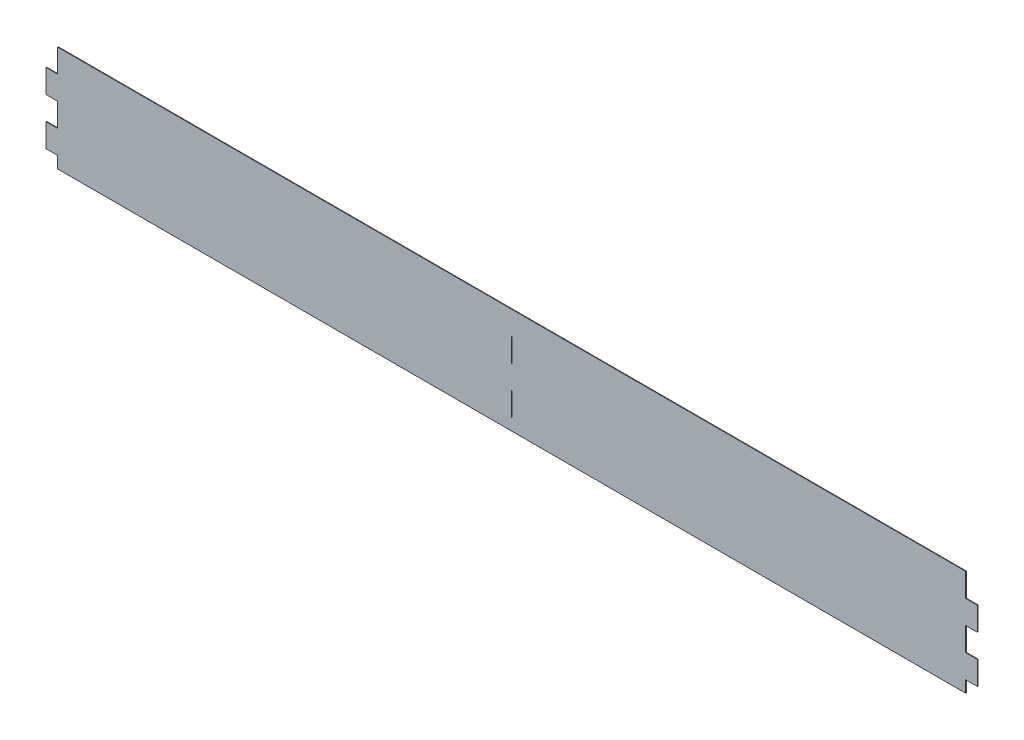
ISO-10303-21;
HEADER;
FILE_DESCRIPTION(('STEP AP214'),'2;1');
FILE_NAME('part.step','',(''),(''),'','','');
FILE_SCHEMA(('AUTOMOTIVE_DESIGN { 1 0 10303 214 1 1 1 1 }'));
ENDSEC;
DATA;
#1=APPLICATION_CONTEXT('core data for automotive mechanical design processes');
#2=APPLICATION_PROTOCOL_DEFINITION('international standard','automotive_design',2000,#1);
#3=PRODUCT_CONTEXT('',#1,'mechanical');
#4=PRODUCT('Part','Part','',(#3));
#5=PRODUCT_RELATED_PRODUCT_CATEGORY('part','',(#4));
#6=PRODUCT_DEFINITION_FORMATION('','',#4);
#7=PRODUCT_DEFINITION_CONTEXT('part definition',#1,'design');
#8=PRODUCT_DEFINITION('design','',#6,#7);
#9=PRODUCT_DEFINITION_SHAPE('','',#8);
#10=(LENGTH_UNIT() NAMED_UNIT(*) SI_UNIT(.MILLI.,.METRE.));
#11=(NAMED_UNIT(*) PLANE_ANGLE_UNIT() SI_UNIT($,.RADIAN.));
#12=(NAMED_UNIT(*) SI_UNIT($,.STERADIAN.) SOLID_ANGLE_UNIT());
#13=UNCERTAINTY_MEASURE_WITH_UNIT(LENGTH_MEASURE(1.E-05),#10,'distance_accuracy_value','');
#14=(GEOMETRIC_REPRESENTATION_CONTEXT(3) GLOBAL_UNCERTAINTY_ASSIGNED_CONTEXT((#13)) GLOBAL_UNIT_ASSIGNED_CONTEXT((#10,
#11,#12)) REPRESENTATION_CONTEXT('',''));
#15=CARTESIAN_POINT('',(0.,0.,0.));
#16=DIRECTION('',(0.,0.,1.));
#17=DIRECTION('',(1.,0.,0.));
#18=AXIS2_PLACEMENT_3D('',#15,#16,#17);
#19=CARTESIAN_POINT('',(-198.5,0.,0.125));
#20=DIRECTION('',(1.,0.,0.));
#21=DIRECTION('',(0.,0.,-1.));
#22=AXIS2_PLACEMENT_3D('',#19,#20,#21);
#23=PLANE('',#22);
#24=DIRECTION('',(0.,-1.,0.));
#25=VECTOR('',#24,1.);
#26=CARTESIAN_POINT('',(-198.5,0.,-0.125));
#27=LINE('',#26,#25);
#28=CARTESIAN_POINT('',(-198.5,35.,-0.125));
#29=VERTEX_POINT('',#28);
#30=CARTESIAN_POINT('',(-198.5,25.,-0.125));
#31=VERTEX_POINT('',#30);
#32=EDGE_CURVE('E243',#29,#31,#27,.T.);
#33=ORIENTED_EDGE('',*,*,#32,.T.);
#34=DIRECTION('',(0.,0.,1.));
#35=VECTOR('',#34,1.);
#36=CARTESIAN_POINT('',(-198.5,25.,-0.125));
#37=LINE('',#36,#35);
#38=CARTESIAN_POINT('',(-198.5,25.,0.125));
#39=VERTEX_POINT('',#38);
#40=EDGE_CURVE('E331',#31,#39,#37,.T.);
#41=ORIENTED_EDGE('',*,*,#40,.T.);
#42=DIRECTION('',(0.,-1.,0.));
#43=VECTOR('',#42,1.);
#44=CARTESIAN_POINT('',(-198.5,0.,0.125));
#45=LINE('',#44,#43);
#46=CARTESIAN_POINT('',(-198.5,35.,0.125));
#47=VERTEX_POINT('',#46);
#48=EDGE_CURVE('E263',#47,#39,#45,.T.);
#49=ORIENTED_EDGE('',*,*,#48,.F.);
#50=DIRECTION('',(0.,0.,1.));
#51=VECTOR('',#50,1.);
#52=CARTESIAN_POINT('',(-198.5,35.,-0.125));
#53=LINE('',#52,#51);
#54=EDGE_CURVE('E361',#29,#47,#53,.T.);
#55=ORIENTED_EDGE('',*,*,#54,.F.);
#56=EDGE_LOOP('',(#33,#41,#49,#55));
#57=FACE_BOUND('',#56,.T.);
#58=ADVANCED_FACE('F35',(#57),#23,.F.);
#59=CARTESIAN_POINT('',(198.5,45.,0.125));
#60=DIRECTION('',(-1.,0.,0.));
#61=DIRECTION('',(0.,0.,1.));
#62=AXIS2_PLACEMENT_3D('',#59,#60,#61);
#63=PLANE('',#62);
#64=DIRECTION('',(0.,1.,0.));
#65=VECTOR('',#64,1.);
#66=CARTESIAN_POINT('',(198.5,45.,0.125));
#67=LINE('',#66,#65);
#68=CARTESIAN_POINT('',(198.5,25.,0.125));
#69=VERTEX_POINT('',#68);
#70=CARTESIAN_POINT('',(198.5,35.,0.125));
#71=VERTEX_POINT('',#70);
#72=EDGE_CURVE('E435',#69,#71,#67,.T.);
#73=ORIENTED_EDGE('',*,*,#72,.F.);
#74=DIRECTION('',(0.,0.,1.));
#75=VECTOR('',#74,1.);
#76=CARTESIAN_POINT('',(198.5,25.,-0.125));
#77=LINE('',#76,#75);
#78=CARTESIAN_POINT('',(198.5,25.,-0.125));
#79=VERTEX_POINT('',#78);
#80=EDGE_CURVE('E304',#79,#69,#77,.T.);
#81=ORIENTED_EDGE('',*,*,#80,.F.);
#82=DIRECTION('',(0.,1.,0.));
#83=VECTOR('',#82,1.);
#84=CARTESIAN_POINT('',(198.5,45.,-0.125));
#85=LINE('',#84,#83);
#86=CARTESIAN_POINT('',(198.5,35.,-0.125));
#87=VERTEX_POINT('',#86);
#88=EDGE_CURVE('E255',#79,#87,#85,.T.);
#89=ORIENTED_EDGE('',*,*,#88,.T.);
#90=DIRECTION('',(0.,0.,1.));
#91=VECTOR('',#90,1.);
#92=CARTESIAN_POINT('',(198.5,35.,-0.125));
#93=LINE('',#92,#91);
#94=EDGE_CURVE('E350',#87,#71,#93,.T.);
#95=ORIENTED_EDGE('',*,*,#94,.T.);
#96=EDGE_LOOP('',(#73,#81,#89,#95));
#97=FACE_BOUND('',#96,.T.);
#98=ADVANCED_FACE('F462',(#97),#63,.F.);
#99=CARTESIAN_POINT('',(-198.5,15.,0.125));
#100=VERTEX_POINT('',#99);
#101=CARTESIAN_POINT('',(-198.5,4.99999999999997,0.125));
#102=VERTEX_POINT('',#101);
#103=EDGE_CURVE('E236',#100,#102,#45,.T.);
#104=ORIENTED_EDGE('',*,*,#103,.F.);
#105=DIRECTION('',(0.,0.,1.));
#106=VECTOR('',#105,1.);
#107=CARTESIAN_POINT('',(-198.5,15.,-0.125));
#108=LINE('',#107,#106);
#109=CARTESIAN_POINT('',(-198.5,15.,-0.125));
#110=VERTEX_POINT('',#109);
#111=EDGE_CURVE('E223',#110,#100,#108,.T.);
#112=ORIENTED_EDGE('',*,*,#111,.F.);
#113=CARTESIAN_POINT('',(-198.5,4.99999999999997,-0.125));
#114=VERTEX_POINT('',#113);
#115=EDGE_CURVE('E234',#110,#114,#27,.T.);
#116=ORIENTED_EDGE('',*,*,#115,.T.);
#117=DIRECTION('',(0.,0.,1.));
#118=VECTOR('',#117,1.);
#119=CARTESIAN_POINT('',(-198.5,4.99999999999997,-0.125));
#120=LINE('',#119,#118);
#121=EDGE_CURVE('E297',#114,#102,#120,.T.);
#122=ORIENTED_EDGE('',*,*,#121,.T.);
#123=EDGE_LOOP('',(#104,#112,#116,#122));
#124=FACE_BOUND('',#123,.T.);
#125=ADVANCED_FACE('F37',(#124),#23,.F.);
#126=CARTESIAN_POINT('',(193.5,0.,0.125));
#127=DIRECTION('',(0.,1.,0.));
#128=DIRECTION('',(0.,0.,1.));
#129=AXIS2_PLACEMENT_3D('',#126,#127,#128);
#130=PLANE('',#129);
#131=DIRECTION('',(1.,0.,0.));
#132=VECTOR('',#131,1.);
#133=CARTESIAN_POINT('',(-193.5,0.,0.125));
#134=LINE('',#133,#132);
#135=CARTESIAN_POINT('',(-193.5,0.,0.125));
#136=VERTEX_POINT('',#135);
#137=CARTESIAN_POINT('',(193.5,0.,0.125));
#138=VERTEX_POINT('',#137);
#139=EDGE_CURVE('E433',#136,#138,#134,.T.);
#140=ORIENTED_EDGE('',*,*,#139,.F.);
#141=DIRECTION('',(0.,0.,-1.));
#142=VECTOR('',#141,1.);
#143=CARTESIAN_POINT('',(-193.5,0.,0.125));
#144=LINE('',#143,#142);
#145=CARTESIAN_POINT('',(-193.5,0.,-0.125));
#146=VERTEX_POINT('',#145);
#147=EDGE_CURVE('E330',#136,#146,#144,.T.);
#148=ORIENTED_EDGE('',*,*,#147,.T.);
#149=DIRECTION('',(1.,0.,0.));
#150=VECTOR('',#149,1.);
#151=CARTESIAN_POINT('',(193.5,0.,-0.125));
#152=LINE('',#151,#150);
#153=CARTESIAN_POINT('',(193.5,0.,-0.125));
#154=VERTEX_POINT('',#153);
#155=EDGE_CURVE('E247',#146,#154,#152,.T.);
#156=ORIENTED_EDGE('',*,*,#155,.T.);
#157=DIRECTION('',(0.,0.,1.));
#158=VECTOR('',#157,1.);
#159=CARTESIAN_POINT('',(193.5,0.,0.125));
#160=LINE('',#159,#158);
#161=EDGE_CURVE('E327',#154,#138,#160,.T.);
#162=ORIENTED_EDGE('',*,*,#161,.T.);
#163=EDGE_LOOP('',(#140,#148,#156,#162));
#164=FACE_BOUND('',#163,.T.);
#165=ADVANCED_FACE('F460',(#164),#130,.F.);
#166=CARTESIAN_POINT('',(198.5,4.99999999999997,-0.125));
#167=VERTEX_POINT('',#166);
#168=CARTESIAN_POINT('',(198.5,15.,-0.125));
#169=VERTEX_POINT('',#168);
#170=EDGE_CURVE('E256',#167,#169,#85,.T.);
#171=ORIENTED_EDGE('',*,*,#170,.T.);
#172=DIRECTION('',(0.,0.,1.));
#173=VECTOR('',#172,1.);
#174=CARTESIAN_POINT('',(198.5,15.,-0.125));
#175=LINE('',#174,#173);
#176=CARTESIAN_POINT('',(198.5,15.,0.125));
#177=VERTEX_POINT('',#176);
#178=EDGE_CURVE('E272',#169,#177,#175,.T.);
#179=ORIENTED_EDGE('',*,*,#178,.T.);
#180=CARTESIAN_POINT('',(198.5,4.99999999999997,0.125));
#181=VERTEX_POINT('',#180);
#182=EDGE_CURVE('E436',#181,#177,#67,.T.);
#183=ORIENTED_EDGE('',*,*,#182,.F.);
#184=DIRECTION('',(0.,0.,1.));
#185=VECTOR('',#184,1.);
#186=CARTESIAN_POINT('',(198.5,4.99999999999997,-0.125));
#187=LINE('',#186,#185);
#188=EDGE_CURVE('E274',#167,#181,#187,.T.);
#189=ORIENTED_EDGE('',*,*,#188,.F.);
#190=EDGE_LOOP('',(#171,#179,#183,#189));
#191=FACE_BOUND('',#190,.T.);
#192=ADVANCED_FACE('F270',(#191),#63,.F.);
#193=CARTESIAN_POINT('',(-198.5,45.,0.125));
#194=DIRECTION('',(0.,-1.,0.));
#195=DIRECTION('',(0.,0.,-1.));
#196=AXIS2_PLACEMENT_3D('',#193,#194,#195);
#197=PLANE('',#196);
#198=DIRECTION('',(-1.,0.,0.));
#199=VECTOR('',#198,1.);
#200=CARTESIAN_POINT('',(198.5,45.,0.125));
#201=LINE('',#200,#199);
#202=CARTESIAN_POINT('',(193.5,45.,0.125));
#203=VERTEX_POINT('',#202);
#204=CARTESIAN_POINT('',(-193.5,45.,0.125));
#205=VERTEX_POINT('',#204);
#206=EDGE_CURVE('E43',#203,#205,#201,.T.);
#207=ORIENTED_EDGE('',*,*,#206,.F.);
#208=DIRECTION('',(0.,0.,1.));
#209=VECTOR('',#208,1.);
#210=CARTESIAN_POINT('',(193.5,45.,-0.125));
#211=LINE('',#210,#209);
#212=CARTESIAN_POINT('',(193.5,45.,-0.125));
#213=VERTEX_POINT('',#212);
#214=EDGE_CURVE('E347',#213,#203,#211,.T.);
#215=ORIENTED_EDGE('',*,*,#214,.F.);
#216=DIRECTION('',(-1.,0.,0.));
#217=VECTOR('',#216,1.);
#218=CARTESIAN_POINT('',(-198.5,45.,-0.125));
#219=LINE('',#218,#217);
#220=CARTESIAN_POINT('',(-193.5,45.,-0.125));
#221=VERTEX_POINT('',#220);
#222=EDGE_CURVE('E257',#213,#221,#219,.T.);
#223=ORIENTED_EDGE('',*,*,#222,.T.);
#224=DIRECTION('',(0.,0.,1.));
#225=VECTOR('',#224,1.);
#226=CARTESIAN_POINT('',(-193.5,45.,-0.125));
#227=LINE('',#226,#225);
#228=EDGE_CURVE('E366',#221,#205,#227,.T.);
#229=ORIENTED_EDGE('',*,*,#228,.T.);
#230=EDGE_LOOP('',(#207,#215,#223,#229));
#231=FACE_BOUND('',#230,.T.);
#232=ADVANCED_FACE('F451',(#231),#197,.F.);
#233=CARTESIAN_POINT('',(0.,0.,0.125));
#234=DIRECTION('',(0.,0.,-1.));
#235=DIRECTION('',(-1.,0.,0.));
#236=AXIS2_PLACEMENT_3D('',#233,#234,#235);
#237=PLANE('',#236);
#238=DIRECTION('',(-1.,0.,0.));
#239=VECTOR('',#238,1.);
#240=CARTESIAN_POINT('',(-0.15,15.,0.125));
#241=LINE('',#240,#239);
#242=CARTESIAN_POINT('',(0.15,15.,0.125));
#243=VERTEX_POINT('',#242);
#244=CARTESIAN_POINT('',(-0.15,15.,0.125));
#245=VERTEX_POINT('',#244);
#246=EDGE_CURVE('E387',#243,#245,#241,.T.);
#247=ORIENTED_EDGE('',*,*,#246,.F.);
#248=DIRECTION('',(0.,1.,0.));
#249=VECTOR('',#248,1.);
#250=CARTESIAN_POINT('',(0.15,15.,0.125));
#251=LINE('',#250,#249);
#252=CARTESIAN_POINT('',(0.150000000000002,5.00000000000002,0.125));
#253=VERTEX_POINT('',#252);
#254=EDGE_CURVE('E368',#253,#243,#251,.T.);
#255=ORIENTED_EDGE('',*,*,#254,.F.);
#256=DIRECTION('',(1.,0.,0.));
#257=VECTOR('',#256,1.);
#258=CARTESIAN_POINT('',(-0.149999999999998,5.00000000000002,0.125));
#259=LINE('',#258,#257);
#260=CARTESIAN_POINT('',(-0.149999999999998,5.00000000000002,0.125));
#261=VERTEX_POINT('',#260);
#262=EDGE_CURVE('E376',#261,#253,#259,.T.);
#263=ORIENTED_EDGE('',*,*,#262,.F.);
#264=DIRECTION('',(0.,-1.,0.));
#265=VECTOR('',#264,1.);
#266=CARTESIAN_POINT('',(-0.15,15.,0.125));
#267=LINE('',#266,#265);
#268=EDGE_CURVE('E390',#245,#261,#267,.T.);
#269=ORIENTED_EDGE('',*,*,#268,.F.);
#270=EDGE_LOOP('',(#247,#255,#263,#269));
#271=FACE_BOUND('',#270,.T.);
#272=DIRECTION('',(-1.,0.,0.));
#273=VECTOR('',#272,1.);
#274=CARTESIAN_POINT('',(-0.150000000000002,35.,0.125));
#275=LINE('',#274,#273);
#276=CARTESIAN_POINT('',(0.149999999999998,35.,0.125));
#277=VERTEX_POINT('',#276);
#278=CARTESIAN_POINT('',(-0.150000000000002,35.,0.125));
#279=VERTEX_POINT('',#278);
#280=EDGE_CURVE('E419',#277,#279,#275,.T.);
#281=ORIENTED_EDGE('',*,*,#280,.F.);
#282=DIRECTION('',(0.,1.,0.));
#283=VECTOR('',#282,1.);
#284=CARTESIAN_POINT('',(0.149999999999998,35.,0.125));
#285=LINE('',#284,#283);
#286=CARTESIAN_POINT('',(0.149999999999999,25.,0.125));
#287=VERTEX_POINT('',#286);
#288=EDGE_CURVE('E397',#287,#277,#285,.T.);
#289=ORIENTED_EDGE('',*,*,#288,.F.);
#290=DIRECTION('',(1.,0.,0.));
#291=VECTOR('',#290,1.);
#292=CARTESIAN_POINT('',(-0.150000000000001,25.,0.125));
#293=LINE('',#292,#291);
#294=CARTESIAN_POINT('',(-0.150000000000001,25.,0.125));
#295=VERTEX_POINT('',#294);
#296=EDGE_CURVE('E408',#295,#287,#293,.T.);
#297=ORIENTED_EDGE('',*,*,#296,.F.);
#298=DIRECTION('',(0.,-1.,0.));
#299=VECTOR('',#298,1.);
#300=CARTESIAN_POINT('',(-0.150000000000002,35.,0.125));
#301=LINE('',#300,#299);
#302=EDGE_CURVE('E422',#279,#295,#301,.T.);
#303=ORIENTED_EDGE('',*,*,#302,.F.);
#304=EDGE_LOOP('',(#281,#289,#297,#303));
#305=FACE_BOUND('',#304,.T.);
#306=ORIENTED_EDGE('',*,*,#48,.T.);
#307=DIRECTION('',(-1.,0.,0.));
#308=VECTOR('',#307,1.);
#309=CARTESIAN_POINT('',(-198.5,25.,0.125));
#310=LINE('',#309,#308);
#311=CARTESIAN_POINT('',(-193.5,25.,0.125));
#312=VERTEX_POINT('',#311);
#313=EDGE_CURVE('E228',#312,#39,#310,.T.);
#314=ORIENTED_EDGE('',*,*,#313,.F.);
#315=DIRECTION('',(0.,1.,0.));
#316=VECTOR('',#315,1.);
#317=CARTESIAN_POINT('',(-193.5,25.,0.125));
#318=LINE('',#317,#316);
#319=CARTESIAN_POINT('',(-193.5,15.,0.125));
#320=VERTEX_POINT('',#319);
#321=EDGE_CURVE('E488',#320,#312,#318,.T.);
#322=ORIENTED_EDGE('',*,*,#321,.F.);
#323=DIRECTION('',(1.,0.,0.));
#324=VECTOR('',#323,1.);
#325=CARTESIAN_POINT('',(-198.5,15.,0.125));
#326=LINE('',#325,#324);
#327=EDGE_CURVE('E303',#100,#320,#326,.T.);
#328=ORIENTED_EDGE('',*,*,#327,.F.);
#329=ORIENTED_EDGE('',*,*,#103,.T.);
#330=DIRECTION('',(-1.,0.,0.));
#331=VECTOR('',#330,1.);
#332=CARTESIAN_POINT('',(-198.5,4.99999999999997,0.125));
#333=LINE('',#332,#331);
#334=CARTESIAN_POINT('',(-193.5,4.99999999999997,0.125));
#335=VERTEX_POINT('',#334);
#336=EDGE_CURVE('E310',#335,#102,#333,.T.);
#337=ORIENTED_EDGE('',*,*,#336,.F.);
#338=DIRECTION('',(0.,1.,0.));
#339=VECTOR('',#338,1.);
#340=CARTESIAN_POINT('',(-193.5,4.99999999999997,0.125));
#341=LINE('',#340,#339);
#342=EDGE_CURVE('E311',#136,#335,#341,.T.);
#343=ORIENTED_EDGE('',*,*,#342,.F.);
#344=ORIENTED_EDGE('',*,*,#139,.T.);
#345=DIRECTION('',(0.,-1.,0.));
#346=VECTOR('',#345,1.);
#347=CARTESIAN_POINT('',(193.5,4.99999999999997,0.125));
#348=LINE('',#347,#346);
#349=CARTESIAN_POINT('',(193.5,4.99999999999997,0.125));
#350=VERTEX_POINT('',#349);
#351=EDGE_CURVE('E321',#350,#138,#348,.T.);
#352=ORIENTED_EDGE('',*,*,#351,.F.);
#353=DIRECTION('',(-1.,0.,0.));
#354=VECTOR('',#353,1.);
#355=CARTESIAN_POINT('',(193.5,4.99999999999997,0.125));
#356=LINE('',#355,#354);
#357=EDGE_CURVE('E319',#181,#350,#356,.T.);
#358=ORIENTED_EDGE('',*,*,#357,.F.);
#359=ORIENTED_EDGE('',*,*,#182,.T.);
#360=DIRECTION('',(1.,0.,0.));
#361=VECTOR('',#360,1.);
#362=CARTESIAN_POINT('',(193.5,15.,0.125));
#363=LINE('',#362,#361);
#364=CARTESIAN_POINT('',(193.5,15.,0.125));
#365=VERTEX_POINT('',#364);
#366=EDGE_CURVE('E296',#365,#177,#363,.T.);
#367=ORIENTED_EDGE('',*,*,#366,.F.);
#368=DIRECTION('',(0.,-1.,0.));
#369=VECTOR('',#368,1.);
#370=CARTESIAN_POINT('',(193.5,25.,0.125));
#371=LINE('',#370,#369);
#372=CARTESIAN_POINT('',(193.5,25.,0.125));
#373=VERTEX_POINT('',#372);
#374=EDGE_CURVE('E293',#373,#365,#371,.T.);
#375=ORIENTED_EDGE('',*,*,#374,.F.);
#376=DIRECTION('',(-1.,0.,0.));
#377=VECTOR('',#376,1.);
#378=CARTESIAN_POINT('',(193.5,25.,0.125));
#379=LINE('',#378,#377);
#380=EDGE_CURVE('E290',#69,#373,#379,.T.);
#381=ORIENTED_EDGE('',*,*,#380,.F.);
#382=ORIENTED_EDGE('',*,*,#72,.T.);
#383=DIRECTION('',(1.,0.,0.));
#384=VECTOR('',#383,1.);
#385=CARTESIAN_POINT('',(193.5,35.,0.125));
#386=LINE('',#385,#384);
#387=CARTESIAN_POINT('',(193.5,35.,0.125));
#388=VERTEX_POINT('',#387);
#389=EDGE_CURVE('E339',#388,#71,#386,.T.);
#390=ORIENTED_EDGE('',*,*,#389,.F.);
#391=DIRECTION('',(0.,-1.,0.));
#392=VECTOR('',#391,1.);
#393=CARTESIAN_POINT('',(193.5,45.,0.125));
#394=LINE('',#393,#392);
#395=EDGE_CURVE('E334',#203,#388,#394,.T.);
#396=ORIENTED_EDGE('',*,*,#395,.F.);
#397=ORIENTED_EDGE('',*,*,#206,.T.);
#398=DIRECTION('',(0.,1.,0.));
#399=VECTOR('',#398,1.);
#400=CARTESIAN_POINT('',(-193.5,45.,0.125));
#401=LINE('',#400,#399);
#402=CARTESIAN_POINT('',(-193.5,35.,0.125));
#403=VERTEX_POINT('',#402);
#404=EDGE_CURVE('E358',#403,#205,#401,.T.);
#405=ORIENTED_EDGE('',*,*,#404,.F.);
#406=DIRECTION('',(1.,0.,0.));
#407=VECTOR('',#406,1.);
#408=CARTESIAN_POINT('',(-198.5,35.,0.125));
#409=LINE('',#408,#407);
#410=EDGE_CURVE('E349',#47,#403,#409,.T.);
#411=ORIENTED_EDGE('',*,*,#410,.F.);
#412=EDGE_LOOP('',(#306,#314,#322,#328,#329,#337,#343,#344,#352,#358,#359,#367,#375,#381,#382,
#390,#396,#397,#405,#411));
#413=FACE_BOUND('',#412,.T.);
#414=ADVANCED_FACE('F446',(#271,#305,#413),#237,.F.);
#415=CARTESIAN_POINT('',(0.,0.,-0.125));
#416=DIRECTION('',(0.,0.,-1.));
#417=DIRECTION('',(-1.,0.,0.));
#418=AXIS2_PLACEMENT_3D('',#415,#416,#417);
#419=PLANE('',#418);
#420=DIRECTION('',(-1.,0.,0.));
#421=VECTOR('',#420,1.);
#422=CARTESIAN_POINT('',(-198.5,25.,-0.125));
#423=LINE('',#422,#421);
#424=CARTESIAN_POINT('',(-193.5,25.,-0.125));
#425=VERTEX_POINT('',#424);
#426=EDGE_CURVE('E237',#425,#31,#423,.T.);
#427=ORIENTED_EDGE('',*,*,#426,.T.);
#428=ORIENTED_EDGE('',*,*,#32,.F.);
#429=DIRECTION('',(1.,0.,0.));
#430=VECTOR('',#429,1.);
#431=CARTESIAN_POINT('',(-198.5,35.,-0.125));
#432=LINE('',#431,#430);
#433=CARTESIAN_POINT('',(-193.5,35.,-0.125));
#434=VERTEX_POINT('',#433);
#435=EDGE_CURVE('E354',#29,#434,#432,.T.);
#436=ORIENTED_EDGE('',*,*,#435,.T.);
#437=DIRECTION('',(0.,1.,0.));
#438=VECTOR('',#437,1.);
#439=CARTESIAN_POINT('',(-193.5,45.,-0.125));
#440=LINE('',#439,#438);
#441=EDGE_CURVE('E357',#434,#221,#440,.T.);
#442=ORIENTED_EDGE('',*,*,#441,.T.);
#443=ORIENTED_EDGE('',*,*,#222,.F.);
#444=DIRECTION('',(0.,-1.,0.));
#445=VECTOR('',#444,1.);
#446=CARTESIAN_POINT('',(193.5,45.,-0.125));
#447=LINE('',#446,#445);
#448=CARTESIAN_POINT('',(193.5,35.,-0.125));
#449=VERTEX_POINT('',#448);
#450=EDGE_CURVE('E335',#213,#449,#447,.T.);
#451=ORIENTED_EDGE('',*,*,#450,.T.);
#452=DIRECTION('',(1.,0.,0.));
#453=VECTOR('',#452,1.);
#454=CARTESIAN_POINT('',(193.5,35.,-0.125));
#455=LINE('',#454,#453);
#456=EDGE_CURVE('E338',#449,#87,#455,.T.);
#457=ORIENTED_EDGE('',*,*,#456,.T.);
#458=ORIENTED_EDGE('',*,*,#88,.F.);
#459=DIRECTION('',(-1.,0.,0.));
#460=VECTOR('',#459,1.);
#461=CARTESIAN_POINT('',(193.5,25.,-0.125));
#462=LINE('',#461,#460);
#463=CARTESIAN_POINT('',(193.5,25.,-0.125));
#464=VERTEX_POINT('',#463);
#465=EDGE_CURVE('E286',#79,#464,#462,.T.);
#466=ORIENTED_EDGE('',*,*,#465,.T.);
#467=DIRECTION('',(0.,-1.,0.));
#468=VECTOR('',#467,1.);
#469=CARTESIAN_POINT('',(193.5,25.,-0.125));
#470=LINE('',#469,#468);
#471=CARTESIAN_POINT('',(193.5,15.,-0.125));
#472=VERTEX_POINT('',#471);
#473=EDGE_CURVE('E284',#464,#472,#470,.T.);
#474=ORIENTED_EDGE('',*,*,#473,.T.);
#475=DIRECTION('',(1.,0.,0.));
#476=VECTOR('',#475,1.);
#477=CARTESIAN_POINT('',(193.5,15.,-0.125));
#478=LINE('',#477,#476);
#479=EDGE_CURVE('E281',#472,#169,#478,.T.);
#480=ORIENTED_EDGE('',*,*,#479,.T.);
#481=ORIENTED_EDGE('',*,*,#170,.F.);
#482=DIRECTION('',(-1.,0.,0.));
#483=VECTOR('',#482,1.);
#484=CARTESIAN_POINT('',(193.5,4.99999999999997,-0.125));
#485=LINE('',#484,#483);
#486=CARTESIAN_POINT('',(193.5,4.99999999999997,-0.125));
#487=VERTEX_POINT('',#486);
#488=EDGE_CURVE('E278',#167,#487,#485,.T.);
#489=ORIENTED_EDGE('',*,*,#488,.T.);
#490=DIRECTION('',(0.,-1.,0.));
#491=VECTOR('',#490,1.);
#492=CARTESIAN_POINT('',(193.5,4.99999999999997,-0.125));
#493=LINE('',#492,#491);
#494=EDGE_CURVE('E317',#487,#154,#493,.T.);
#495=ORIENTED_EDGE('',*,*,#494,.T.);
#496=ORIENTED_EDGE('',*,*,#155,.F.);
#497=DIRECTION('',(0.,-1.,0.));
#498=VECTOR('',#497,1.);
#499=CARTESIAN_POINT('',(-193.5,0.,-0.125));
#500=LINE('',#499,#498);
#501=CARTESIAN_POINT('',(-193.5,4.99999999999997,-0.125));
#502=VERTEX_POINT('',#501);
#503=EDGE_CURVE('E11',#502,#146,#500,.T.);
#504=ORIENTED_EDGE('',*,*,#503,.F.);
#505=DIRECTION('',(-1.,0.,0.));
#506=VECTOR('',#505,1.);
#507=CARTESIAN_POINT('',(-198.5,4.99999999999997,-0.125));
#508=LINE('',#507,#506);
#509=EDGE_CURVE('E58',#502,#114,#508,.T.);
#510=ORIENTED_EDGE('',*,*,#509,.T.);
#511=ORIENTED_EDGE('',*,*,#115,.F.);
#512=DIRECTION('',(1.,0.,0.));
#513=VECTOR('',#512,1.);
#514=CARTESIAN_POINT('',(-198.5,15.,-0.125));
#515=LINE('',#514,#513);
#516=CARTESIAN_POINT('',(-193.5,15.,-0.125));
#517=VERTEX_POINT('',#516);
#518=EDGE_CURVE('E219',#110,#517,#515,.T.);
#519=ORIENTED_EDGE('',*,*,#518,.T.);
#520=DIRECTION('',(0.,1.,0.));
#521=VECTOR('',#520,1.);
#522=CARTESIAN_POINT('',(-193.5,25.,-0.125));
#523=LINE('',#522,#521);
#524=EDGE_CURVE('E50',#517,#425,#523,.T.);
#525=ORIENTED_EDGE('',*,*,#524,.T.);
#526=EDGE_LOOP('',(#427,#428,#436,#442,#443,#451,#457,#458,#466,#474,#480,#481,#489,#495,#496,
#504,#510,#511,#519,#525));
#527=FACE_BOUND('',#526,.T.);
#528=DIRECTION('',(0.,1.,0.));
#529=VECTOR('',#528,1.);
#530=CARTESIAN_POINT('',(0.15,15.,-0.125));
#531=LINE('',#530,#529);
#532=CARTESIAN_POINT('',(0.150000000000002,5.00000000000002,-0.125));
#533=VERTEX_POINT('',#532);
#534=CARTESIAN_POINT('',(0.15,15.,-0.125));
#535=VERTEX_POINT('',#534);
#536=EDGE_CURVE('E372',#533,#535,#531,.T.);
#537=ORIENTED_EDGE('',*,*,#536,.T.);
#538=DIRECTION('',(-1.,0.,0.));
#539=VECTOR('',#538,1.);
#540=CARTESIAN_POINT('',(-0.15,15.,-0.125));
#541=LINE('',#540,#539);
#542=CARTESIAN_POINT('',(-0.15,15.,-0.125));
#543=VERTEX_POINT('',#542);
#544=EDGE_CURVE('E375',#535,#543,#541,.T.);
#545=ORIENTED_EDGE('',*,*,#544,.T.);
#546=DIRECTION('',(0.,-1.,0.));
#547=VECTOR('',#546,1.);
#548=CARTESIAN_POINT('',(-0.15,15.,-0.125));
#549=LINE('',#548,#547);
#550=CARTESIAN_POINT('',(-0.149999999999998,5.00000000000002,-0.125));
#551=VERTEX_POINT('',#550);
#552=EDGE_CURVE('E379',#543,#551,#549,.T.);
#553=ORIENTED_EDGE('',*,*,#552,.T.);
#554=DIRECTION('',(1.,0.,0.));
#555=VECTOR('',#554,1.);
#556=CARTESIAN_POINT('',(-0.149999999999998,5.00000000000002,-0.125));
#557=LINE('',#556,#555);
#558=EDGE_CURVE('E382',#551,#533,#557,.T.);
#559=ORIENTED_EDGE('',*,*,#558,.T.);
#560=EDGE_LOOP('',(#537,#545,#553,#559));
#561=FACE_BOUND('',#560,.T.);
#562=DIRECTION('',(0.,1.,0.));
#563=VECTOR('',#562,1.);
#564=CARTESIAN_POINT('',(0.149999999999998,35.,-0.125));
#565=LINE('',#564,#563);
#566=CARTESIAN_POINT('',(0.149999999999999,25.,-0.125));
#567=VERTEX_POINT('',#566);
#568=CARTESIAN_POINT('',(0.149999999999998,35.,-0.125));
#569=VERTEX_POINT('',#568);
#570=EDGE_CURVE('E404',#567,#569,#565,.T.);
#571=ORIENTED_EDGE('',*,*,#570,.T.);
#572=DIRECTION('',(-1.,0.,0.));
#573=VECTOR('',#572,1.);
#574=CARTESIAN_POINT('',(-0.150000000000002,35.,-0.125));
#575=LINE('',#574,#573);
#576=CARTESIAN_POINT('',(-0.150000000000002,35.,-0.125));
#577=VERTEX_POINT('',#576);
#578=EDGE_CURVE('E407',#569,#577,#575,.T.);
#579=ORIENTED_EDGE('',*,*,#578,.T.);
#580=DIRECTION('',(0.,-1.,0.));
#581=VECTOR('',#580,1.);
#582=CARTESIAN_POINT('',(-0.150000000000002,35.,-0.125));
#583=LINE('',#582,#581);
#584=CARTESIAN_POINT('',(-0.150000000000001,25.,-0.125));
#585=VERTEX_POINT('',#584);
#586=EDGE_CURVE('E411',#577,#585,#583,.T.);
#587=ORIENTED_EDGE('',*,*,#586,.T.);
#588=DIRECTION('',(1.,0.,0.));
#589=VECTOR('',#588,1.);
#590=CARTESIAN_POINT('',(-0.150000000000001,25.,-0.125));
#591=LINE('',#590,#589);
#592=EDGE_CURVE('E414',#585,#567,#591,.T.);
#593=ORIENTED_EDGE('',*,*,#592,.T.);
#594=EDGE_LOOP('',(#571,#579,#587,#593));
#595=FACE_BOUND('',#594,.T.);
#596=ADVANCED_FACE('F240',(#527,#561,#595),#419,.T.);
#597=CARTESIAN_POINT('',(0.149999999999998,35.,-0.125));
#598=DIRECTION('',(1.,0.,0.));
#599=DIRECTION('',(0.,1.,0.));
#600=AXIS2_PLACEMENT_3D('',#597,#598,#599);
#601=PLANE('',#600);
#602=ORIENTED_EDGE('',*,*,#288,.T.);
#603=DIRECTION('',(0.,0.,1.));
#604=VECTOR('',#603,1.);
#605=CARTESIAN_POINT('',(0.149999999999998,35.,-0.125));
#606=LINE('',#605,#604);
#607=EDGE_CURVE('E417',#569,#277,#606,.T.);
#608=ORIENTED_EDGE('',*,*,#607,.F.);
#609=ORIENTED_EDGE('',*,*,#570,.F.);
#610=DIRECTION('',(0.,0.,1.));
#611=VECTOR('',#610,1.);
#612=CARTESIAN_POINT('',(0.149999999999999,25.,-0.125));
#613=LINE('',#612,#611);
#614=EDGE_CURVE('E244',#567,#287,#613,.T.);
#615=ORIENTED_EDGE('',*,*,#614,.T.);
#616=EDGE_LOOP('',(#602,#608,#609,#615));
#617=FACE_BOUND('',#616,.T.);
#618=ADVANCED_FACE('F541',(#617),#601,.F.);
#619=CARTESIAN_POINT('',(-0.150000000000001,25.,-0.125));
#620=DIRECTION('',(0.,-1.,0.));
#621=DIRECTION('',(0.,0.,-1.));
#622=AXIS2_PLACEMENT_3D('',#619,#620,#621);
#623=PLANE('',#622);
#624=ORIENTED_EDGE('',*,*,#296,.T.);
#625=ORIENTED_EDGE('',*,*,#614,.F.);
#626=ORIENTED_EDGE('',*,*,#592,.F.);
#627=DIRECTION('',(0.,0.,1.));
#628=VECTOR('',#627,1.);
#629=CARTESIAN_POINT('',(-0.150000000000001,25.,-0.125));
#630=LINE('',#629,#628);
#631=EDGE_CURVE('E248',#585,#295,#630,.T.);
#632=ORIENTED_EDGE('',*,*,#631,.T.);
#633=EDGE_LOOP('',(#624,#625,#626,#632));
#634=FACE_BOUND('',#633,.T.);
#635=ADVANCED_FACE('F537',(#634),#623,.F.);
#636=CARTESIAN_POINT('',(-0.150000000000002,35.,-0.125));
#637=DIRECTION('',(-1.,0.,0.));
#638=DIRECTION('',(0.,-1.,0.));
#639=AXIS2_PLACEMENT_3D('',#636,#637,#638);
#640=PLANE('',#639);
#641=ORIENTED_EDGE('',*,*,#302,.T.);
#642=ORIENTED_EDGE('',*,*,#631,.F.);
#643=ORIENTED_EDGE('',*,*,#586,.F.);
#644=DIRECTION('',(0.,0.,1.));
#645=VECTOR('',#644,1.);
#646=CARTESIAN_POINT('',(-0.150000000000002,35.,-0.125));
#647=LINE('',#646,#645);
#648=EDGE_CURVE('E428',#577,#279,#647,.T.);
#649=ORIENTED_EDGE('',*,*,#648,.T.);
#650=EDGE_LOOP('',(#641,#642,#643,#649));
#651=FACE_BOUND('',#650,.T.);
#652=ADVANCED_FACE('F540',(#651),#640,.F.);
#653=CARTESIAN_POINT('',(-0.150000000000002,35.,-0.125));
#654=DIRECTION('',(0.,1.,0.));
#655=DIRECTION('',(0.,0.,1.));
#656=AXIS2_PLACEMENT_3D('',#653,#654,#655);
#657=PLANE('',#656);
#658=ORIENTED_EDGE('',*,*,#280,.T.);
#659=ORIENTED_EDGE('',*,*,#648,.F.);
#660=ORIENTED_EDGE('',*,*,#578,.F.);
#661=ORIENTED_EDGE('',*,*,#607,.T.);
#662=EDGE_LOOP('',(#658,#659,#660,#661));
#663=FACE_BOUND('',#662,.T.);
#664=ADVANCED_FACE('F535',(#663),#657,.F.);
#665=CARTESIAN_POINT('',(0.15,15.,-0.125));
#666=DIRECTION('',(1.,0.,0.));
#667=DIRECTION('',(0.,1.,0.));
#668=AXIS2_PLACEMENT_3D('',#665,#666,#667);
#669=PLANE('',#668);
#670=ORIENTED_EDGE('',*,*,#254,.T.);
#671=DIRECTION('',(0.,0.,1.));
#672=VECTOR('',#671,1.);
#673=CARTESIAN_POINT('',(0.15,15.,-0.125));
#674=LINE('',#673,#672);
#675=EDGE_CURVE('E385',#535,#243,#674,.T.);
#676=ORIENTED_EDGE('',*,*,#675,.F.);
#677=ORIENTED_EDGE('',*,*,#536,.F.);
#678=DIRECTION('',(0.,0.,1.));
#679=VECTOR('',#678,1.);
#680=CARTESIAN_POINT('',(0.150000000000002,5.00000000000002,-0.125));
#681=LINE('',#680,#679);
#682=EDGE_CURVE('E395',#533,#253,#681,.T.);
#683=ORIENTED_EDGE('',*,*,#682,.T.);
#684=EDGE_LOOP('',(#670,#676,#677,#683));
#685=FACE_BOUND('',#684,.T.);
#686=ADVANCED_FACE('F525',(#685),#669,.F.);
#687=CARTESIAN_POINT('',(-0.149999999999998,5.00000000000002,-0.125));
#688=DIRECTION('',(0.,-1.,0.));
#689=DIRECTION('',(0.,0.,-1.));
#690=AXIS2_PLACEMENT_3D('',#687,#688,#689);
#691=PLANE('',#690);
#692=ORIENTED_EDGE('',*,*,#262,.T.);
#693=ORIENTED_EDGE('',*,*,#682,.F.);
#694=ORIENTED_EDGE('',*,*,#558,.F.);
#695=DIRECTION('',(0.,0.,1.));
#696=VECTOR('',#695,1.);
#697=CARTESIAN_POINT('',(-0.149999999999998,5.00000000000002,-0.125));
#698=LINE('',#697,#696);
#699=EDGE_CURVE('E398',#551,#261,#698,.T.);
#700=ORIENTED_EDGE('',*,*,#699,.T.);
#701=EDGE_LOOP('',(#692,#693,#694,#700));
#702=FACE_BOUND('',#701,.T.);
#703=ADVANCED_FACE('F521',(#702),#691,.F.);
#704=CARTESIAN_POINT('',(-0.15,15.,-0.125));
#705=DIRECTION('',(-1.,0.,0.));
#706=DIRECTION('',(0.,-1.,0.));
#707=AXIS2_PLACEMENT_3D('',#704,#705,#706);
#708=PLANE('',#707);
#709=ORIENTED_EDGE('',*,*,#268,.T.);
#710=ORIENTED_EDGE('',*,*,#699,.F.);
#711=ORIENTED_EDGE('',*,*,#552,.F.);
#712=DIRECTION('',(0.,0.,1.));
#713=VECTOR('',#712,1.);
#714=CARTESIAN_POINT('',(-0.15,15.,-0.125));
#715=LINE('',#714,#713);
#716=EDGE_CURVE('E400',#543,#245,#715,.T.);
#717=ORIENTED_EDGE('',*,*,#716,.T.);
#718=EDGE_LOOP('',(#709,#710,#711,#717));
#719=FACE_BOUND('',#718,.T.);
#720=ADVANCED_FACE('F524',(#719),#708,.F.);
#721=CARTESIAN_POINT('',(-0.15,15.,-0.125));
#722=DIRECTION('',(0.,1.,0.));
#723=DIRECTION('',(0.,0.,1.));
#724=AXIS2_PLACEMENT_3D('',#721,#722,#723);
#725=PLANE('',#724);
#726=ORIENTED_EDGE('',*,*,#246,.T.);
#727=ORIENTED_EDGE('',*,*,#716,.F.);
#728=ORIENTED_EDGE('',*,*,#544,.F.);
#729=ORIENTED_EDGE('',*,*,#675,.T.);
#730=EDGE_LOOP('',(#726,#727,#728,#729));
#731=FACE_BOUND('',#730,.T.);
#732=ADVANCED_FACE('F518',(#731),#725,.F.);
#733=CARTESIAN_POINT('',(-193.5,45.,-0.125));
#734=DIRECTION('',(1.,0.,0.));
#735=DIRECTION('',(0.,0.,-1.));
#736=AXIS2_PLACEMENT_3D('',#733,#734,#735);
#737=PLANE('',#736);
#738=ORIENTED_EDGE('',*,*,#404,.T.);
#739=ORIENTED_EDGE('',*,*,#228,.F.);
#740=ORIENTED_EDGE('',*,*,#441,.F.);
#741=DIRECTION('',(0.,0.,1.));
#742=VECTOR('',#741,1.);
#743=CARTESIAN_POINT('',(-193.5,35.,-0.125));
#744=LINE('',#743,#742);
#745=EDGE_CURVE('E369',#434,#403,#744,.T.);
#746=ORIENTED_EDGE('',*,*,#745,.T.);
#747=EDGE_LOOP('',(#738,#739,#740,#746));
#748=FACE_BOUND('',#747,.T.);
#749=ADVANCED_FACE('F449',(#748),#737,.F.);
#750=CARTESIAN_POINT('',(-198.5,35.,-0.125));
#751=DIRECTION('',(0.,-1.,0.));
#752=DIRECTION('',(0.,0.,-1.));
#753=AXIS2_PLACEMENT_3D('',#750,#751,#752);
#754=PLANE('',#753);
#755=ORIENTED_EDGE('',*,*,#410,.T.);
#756=ORIENTED_EDGE('',*,*,#745,.F.);
#757=ORIENTED_EDGE('',*,*,#435,.F.);
#758=ORIENTED_EDGE('',*,*,#54,.T.);
#759=EDGE_LOOP('',(#755,#756,#757,#758));
#760=FACE_BOUND('',#759,.T.);
#761=ADVANCED_FACE('F507',(#760),#754,.F.);
#762=CARTESIAN_POINT('',(193.5,45.,-0.125));
#763=DIRECTION('',(-1.,0.,0.));
#764=DIRECTION('',(0.,0.,1.));
#765=AXIS2_PLACEMENT_3D('',#762,#763,#764);
#766=PLANE('',#765);
#767=ORIENTED_EDGE('',*,*,#395,.T.);
#768=DIRECTION('',(0.,0.,1.));
#769=VECTOR('',#768,1.);
#770=CARTESIAN_POINT('',(193.5,35.,-0.125));
#771=LINE('',#770,#769);
#772=EDGE_CURVE('E342',#449,#388,#771,.T.);
#773=ORIENTED_EDGE('',*,*,#772,.F.);
#774=ORIENTED_EDGE('',*,*,#450,.F.);
#775=ORIENTED_EDGE('',*,*,#214,.T.);
#776=EDGE_LOOP('',(#767,#773,#774,#775));
#777=FACE_BOUND('',#776,.T.);
#778=ADVANCED_FACE('F509',(#777),#766,.F.);
#779=CARTESIAN_POINT('',(193.5,35.,-0.125));
#780=DIRECTION('',(0.,-1.,0.));
#781=DIRECTION('',(0.,0.,-1.));
#782=AXIS2_PLACEMENT_3D('',#779,#780,#781);
#783=PLANE('',#782);
#784=ORIENTED_EDGE('',*,*,#389,.T.);
#785=ORIENTED_EDGE('',*,*,#94,.F.);
#786=ORIENTED_EDGE('',*,*,#456,.F.);
#787=ORIENTED_EDGE('',*,*,#772,.T.);
#788=EDGE_LOOP('',(#784,#785,#786,#787));
#789=FACE_BOUND('',#788,.T.);
#790=ADVANCED_FACE('F515',(#789),#783,.F.);
#791=CARTESIAN_POINT('',(193.5,4.99999999999997,-0.125));
#792=DIRECTION('',(-1.,0.,0.));
#793=DIRECTION('',(0.,0.,1.));
#794=AXIS2_PLACEMENT_3D('',#791,#792,#793);
#795=PLANE('',#794);
#796=ORIENTED_EDGE('',*,*,#494,.F.);
#797=DIRECTION('',(0.,0.,1.));
#798=VECTOR('',#797,1.);
#799=CARTESIAN_POINT('',(193.5,4.99999999999997,-0.125));
#800=LINE('',#799,#798);
#801=EDGE_CURVE('E313',#487,#350,#800,.T.);
#802=ORIENTED_EDGE('',*,*,#801,.T.);
#803=ORIENTED_EDGE('',*,*,#351,.T.);
#804=ORIENTED_EDGE('',*,*,#161,.F.);
#805=EDGE_LOOP('',(#796,#802,#803,#804));
#806=FACE_BOUND('',#805,.T.);
#807=ADVANCED_FACE('F676',(#806),#795,.F.);
#808=CARTESIAN_POINT('',(193.5,4.99999999999997,-0.125));
#809=DIRECTION('',(0.,1.,0.));
#810=DIRECTION('',(0.,0.,1.));
#811=AXIS2_PLACEMENT_3D('',#808,#809,#810);
#812=PLANE('',#811);
#813=ORIENTED_EDGE('',*,*,#357,.T.);
#814=ORIENTED_EDGE('',*,*,#801,.F.);
#815=ORIENTED_EDGE('',*,*,#488,.F.);
#816=ORIENTED_EDGE('',*,*,#188,.T.);
#817=EDGE_LOOP('',(#813,#814,#815,#816));
#818=FACE_BOUND('',#817,.T.);
#819=ADVANCED_FACE('F685',(#818),#812,.F.);
#820=CARTESIAN_POINT('',(-193.5,4.99999999999997,-0.125));
#821=DIRECTION('',(1.,0.,0.));
#822=DIRECTION('',(0.,0.,-1.));
#823=AXIS2_PLACEMENT_3D('',#820,#821,#822);
#824=PLANE('',#823);
#825=ORIENTED_EDGE('',*,*,#342,.T.);
#826=DIRECTION('',(0.,0.,1.));
#827=VECTOR('',#826,1.);
#828=CARTESIAN_POINT('',(-193.5,4.99999999999997,-0.125));
#829=LINE('',#828,#827);
#830=EDGE_CURVE('E309',#502,#335,#829,.T.);
#831=ORIENTED_EDGE('',*,*,#830,.F.);
#832=ORIENTED_EDGE('',*,*,#503,.T.);
#833=ORIENTED_EDGE('',*,*,#147,.F.);
#834=EDGE_LOOP('',(#825,#831,#832,#833));
#835=FACE_BOUND('',#834,.T.);
#836=ADVANCED_FACE('F483',(#835),#824,.F.);
#837=CARTESIAN_POINT('',(-198.5,4.99999999999997,-0.125));
#838=DIRECTION('',(0.,1.,0.));
#839=DIRECTION('',(0.,0.,1.));
#840=AXIS2_PLACEMENT_3D('',#837,#838,#839);
#841=PLANE('',#840);
#842=ORIENTED_EDGE('',*,*,#336,.T.);
#843=ORIENTED_EDGE('',*,*,#121,.F.);
#844=ORIENTED_EDGE('',*,*,#509,.F.);
#845=ORIENTED_EDGE('',*,*,#830,.T.);
#846=EDGE_LOOP('',(#842,#843,#844,#845));
#847=FACE_BOUND('',#846,.T.);
#848=ADVANCED_FACE('F484',(#847),#841,.F.);
#849=CARTESIAN_POINT('',(193.5,25.,-0.125));
#850=DIRECTION('',(-1.,0.,0.));
#851=DIRECTION('',(0.,0.,1.));
#852=AXIS2_PLACEMENT_3D('',#849,#850,#851);
#853=PLANE('',#852);
#854=ORIENTED_EDGE('',*,*,#374,.T.);
#855=DIRECTION('',(0.,0.,1.));
#856=VECTOR('',#855,1.);
#857=CARTESIAN_POINT('',(193.5,15.,-0.125));
#858=LINE('',#857,#856);
#859=EDGE_CURVE('E288',#472,#365,#858,.T.);
#860=ORIENTED_EDGE('',*,*,#859,.F.);
#861=ORIENTED_EDGE('',*,*,#473,.F.);
#862=DIRECTION('',(0.,0.,1.));
#863=VECTOR('',#862,1.);
#864=CARTESIAN_POINT('',(193.5,25.,-0.125));
#865=LINE('',#864,#863);
#866=EDGE_CURVE('E301',#464,#373,#865,.T.);
#867=ORIENTED_EDGE('',*,*,#866,.T.);
#868=EDGE_LOOP('',(#854,#860,#861,#867));
#869=FACE_BOUND('',#868,.T.);
#870=ADVANCED_FACE('F709',(#869),#853,.F.);
#871=CARTESIAN_POINT('',(193.5,25.,-0.125));
#872=DIRECTION('',(0.,1.,0.));
#873=DIRECTION('',(0.,0.,1.));
#874=AXIS2_PLACEMENT_3D('',#871,#872,#873);
#875=PLANE('',#874);
#876=ORIENTED_EDGE('',*,*,#380,.T.);
#877=ORIENTED_EDGE('',*,*,#866,.F.);
#878=ORIENTED_EDGE('',*,*,#465,.F.);
#879=ORIENTED_EDGE('',*,*,#80,.T.);
#880=EDGE_LOOP('',(#876,#877,#878,#879));
#881=FACE_BOUND('',#880,.T.);
#882=ADVANCED_FACE('F717',(#881),#875,.F.);
#883=CARTESIAN_POINT('',(193.5,15.,-0.125));
#884=DIRECTION('',(0.,-1.,0.));
#885=DIRECTION('',(0.,0.,-1.));
#886=AXIS2_PLACEMENT_3D('',#883,#884,#885);
#887=PLANE('',#886);
#888=ORIENTED_EDGE('',*,*,#366,.T.);
#889=ORIENTED_EDGE('',*,*,#178,.F.);
#890=ORIENTED_EDGE('',*,*,#479,.F.);
#891=ORIENTED_EDGE('',*,*,#859,.T.);
#892=EDGE_LOOP('',(#888,#889,#890,#891));
#893=FACE_BOUND('',#892,.T.);
#894=ADVANCED_FACE('F726',(#893),#887,.F.);
#895=CARTESIAN_POINT('',(-198.5,25.,-0.125));
#896=DIRECTION('',(0.,1.,0.));
#897=DIRECTION('',(0.,0.,1.));
#898=AXIS2_PLACEMENT_3D('',#895,#896,#897);
#899=PLANE('',#898);
#900=ORIENTED_EDGE('',*,*,#313,.T.);
#901=ORIENTED_EDGE('',*,*,#40,.F.);
#902=ORIENTED_EDGE('',*,*,#426,.F.);
#903=DIRECTION('',(0.,0.,1.));
#904=VECTOR('',#903,1.);
#905=CARTESIAN_POINT('',(-193.5,25.,-0.125));
#906=LINE('',#905,#904);
#907=EDGE_CURVE('E497',#425,#312,#906,.T.);
#908=ORIENTED_EDGE('',*,*,#907,.T.);
#909=EDGE_LOOP('',(#900,#901,#902,#908));
#910=FACE_BOUND('',#909,.T.);
#911=ADVANCED_FACE('F503',(#910),#899,.F.);
#912=CARTESIAN_POINT('',(-193.5,25.,-0.125));
#913=DIRECTION('',(1.,0.,0.));
#914=DIRECTION('',(0.,0.,-1.));
#915=AXIS2_PLACEMENT_3D('',#912,#913,#914);
#916=PLANE('',#915);
#917=ORIENTED_EDGE('',*,*,#321,.T.);
#918=ORIENTED_EDGE('',*,*,#907,.F.);
#919=ORIENTED_EDGE('',*,*,#524,.F.);
#920=DIRECTION('',(0.,0.,1.));
#921=VECTOR('',#920,1.);
#922=CARTESIAN_POINT('',(-193.5,15.,-0.125));
#923=LINE('',#922,#921);
#924=EDGE_CURVE('E225',#517,#320,#923,.T.);
#925=ORIENTED_EDGE('',*,*,#924,.T.);
#926=EDGE_LOOP('',(#917,#918,#919,#925));
#927=FACE_BOUND('',#926,.T.);
#928=ADVANCED_FACE('F499',(#927),#916,.F.);
#929=CARTESIAN_POINT('',(-198.5,15.,-0.125));
#930=DIRECTION('',(0.,-1.,0.));
#931=DIRECTION('',(0.,0.,-1.));
#932=AXIS2_PLACEMENT_3D('',#929,#930,#931);
#933=PLANE('',#932);
#934=ORIENTED_EDGE('',*,*,#327,.T.);
#935=ORIENTED_EDGE('',*,*,#924,.F.);
#936=ORIENTED_EDGE('',*,*,#518,.F.);
#937=ORIENTED_EDGE('',*,*,#111,.T.);
#938=EDGE_LOOP('',(#934,#935,#936,#937));
#939=FACE_BOUND('',#938,.T.);
#940=ADVANCED_FACE('F222',(#939),#933,.F.);
#941=CLOSED_SHELL('',(#58,#98,#125,#165,#192,#232,#414,#596,#618,#635,#652,#664,#686,#703,#720,
#732,#749,#761,#778,#790,#807,#819,#836,#848,#870,#882,#894,#911,#928,#940));
#942=MANIFOLD_SOLID_BREP('B2',#941);
#943=ADVANCED_BREP_SHAPE_REPRESENTATION('',(#18,#942),#14);
#944=SHAPE_DEFINITION_REPRESENTATION(#9,#943);
ENDSEC;
END-ISO-10303-21;
